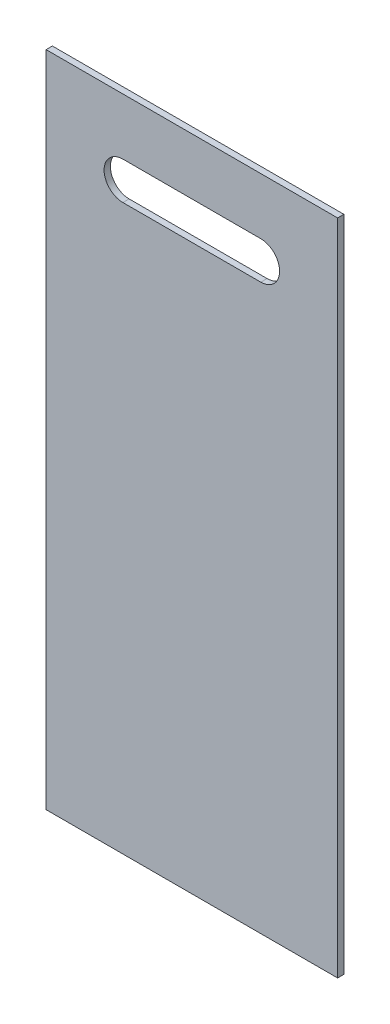
ISO-10303-21;
HEADER;
FILE_DESCRIPTION(('STEP AP214'),'2;1');
FILE_NAME('part.step','',(''),(''),'','','');
FILE_SCHEMA(('AUTOMOTIVE_DESIGN { 1 0 10303 214 1 1 1 1 }'));
ENDSEC;
DATA;
#1=APPLICATION_CONTEXT('core data for automotive mechanical design processes');
#2=APPLICATION_PROTOCOL_DEFINITION('international standard','automotive_design',2000,#1);
#3=PRODUCT_CONTEXT('',#1,'mechanical');
#4=PRODUCT('Part','Part','',(#3));
#5=PRODUCT_RELATED_PRODUCT_CATEGORY('part','',(#4));
#6=PRODUCT_DEFINITION_FORMATION('','',#4);
#7=PRODUCT_DEFINITION_CONTEXT('part definition',#1,'design');
#8=PRODUCT_DEFINITION('design','',#6,#7);
#9=PRODUCT_DEFINITION_SHAPE('','',#8);
#10=(LENGTH_UNIT() NAMED_UNIT(*) SI_UNIT(.MILLI.,.METRE.));
#11=(NAMED_UNIT(*) PLANE_ANGLE_UNIT() SI_UNIT($,.RADIAN.));
#12=(NAMED_UNIT(*) SI_UNIT($,.STERADIAN.) SOLID_ANGLE_UNIT());
#13=UNCERTAINTY_MEASURE_WITH_UNIT(LENGTH_MEASURE(1.E-05),#10,'distance_accuracy_value','');
#14=(GEOMETRIC_REPRESENTATION_CONTEXT(3) GLOBAL_UNCERTAINTY_ASSIGNED_CONTEXT((#13)) GLOBAL_UNIT_ASSIGNED_CONTEXT((#10,
#11,#12)) REPRESENTATION_CONTEXT('',''));
#15=CARTESIAN_POINT('',(0.,0.,0.));
#16=DIRECTION('',(0.,0.,1.));
#17=DIRECTION('',(1.,0.,0.));
#18=AXIS2_PLACEMENT_3D('',#15,#16,#17);
#19=CARTESIAN_POINT('',(0.,0.,5.));
#20=DIRECTION('',(0.,0.,-1.));
#21=DIRECTION('',(-1.,0.,0.));
#22=AXIS2_PLACEMENT_3D('',#19,#20,#21);
#23=PLANE('',#22);
#24=DIRECTION('',(0.,1.,0.));
#25=VECTOR('',#24,1.);
#26=CARTESIAN_POINT('',(116.25,-262.5,5.));
#27=LINE('',#26,#25);
#28=CARTESIAN_POINT('',(116.25,-262.5,5.));
#29=VERTEX_POINT('',#28);
#30=CARTESIAN_POINT('',(116.25,262.5,5.));
#31=VERTEX_POINT('',#30);
#32=EDGE_CURVE('E153',#29,#31,#27,.T.);
#33=ORIENTED_EDGE('',*,*,#32,.T.);
#34=DIRECTION('',(-1.,0.,0.));
#35=VECTOR('',#34,1.);
#36=CARTESIAN_POINT('',(-116.25,262.5,5.));
#37=LINE('',#36,#35);
#38=CARTESIAN_POINT('',(-116.25,262.5,5.));
#39=VERTEX_POINT('',#38);
#40=EDGE_CURVE('E157',#31,#39,#37,.T.);
#41=ORIENTED_EDGE('',*,*,#40,.T.);
#42=DIRECTION('',(0.,-1.,0.));
#43=VECTOR('',#42,1.);
#44=CARTESIAN_POINT('',(-116.25,-262.5,5.));
#45=LINE('',#44,#43);
#46=CARTESIAN_POINT('',(-116.25,-262.5,5.));
#47=VERTEX_POINT('',#46);
#48=EDGE_CURVE('E161',#39,#47,#45,.T.);
#49=ORIENTED_EDGE('',*,*,#48,.T.);
#50=DIRECTION('',(1.,0.,0.));
#51=VECTOR('',#50,1.);
#52=CARTESIAN_POINT('',(-116.25,-262.5,5.));
#53=LINE('',#52,#51);
#54=EDGE_CURVE('E164',#47,#29,#53,.T.);
#55=ORIENTED_EDGE('',*,*,#54,.T.);
#56=EDGE_LOOP('',(#33,#41,#49,#55));
#57=FACE_BOUND('',#56,.T.);
#58=CARTESIAN_POINT('',(-55.,202.5,5.));
#59=DIRECTION('',(0.,0.,1.));
#60=DIRECTION('',(1.,0.,0.));
#61=AXIS2_PLACEMENT_3D('',#58,#59,#60);
#62=CIRCLE('',#61,15.);
#63=CARTESIAN_POINT('',(-55.,217.5,5.));
#64=VERTEX_POINT('',#63);
#65=CARTESIAN_POINT('',(-55.,187.5,5.));
#66=VERTEX_POINT('',#65);
#67=EDGE_CURVE('E105',#64,#66,#62,.T.);
#68=ORIENTED_EDGE('',*,*,#67,.F.);
#69=DIRECTION('',(-1.,0.,0.));
#70=VECTOR('',#69,1.);
#71=CARTESIAN_POINT('',(-55.,217.5,5.));
#72=LINE('',#71,#70);
#73=CARTESIAN_POINT('',(55.,217.5,5.));
#74=VERTEX_POINT('',#73);
#75=EDGE_CURVE('E131',#74,#64,#72,.T.);
#76=ORIENTED_EDGE('',*,*,#75,.F.);
#77=CARTESIAN_POINT('',(55.,202.5,5.));
#78=DIRECTION('',(0.,0.,1.));
#79=DIRECTION('',(1.,0.,0.));
#80=AXIS2_PLACEMENT_3D('',#77,#78,#79);
#81=CIRCLE('',#80,15.);
#82=CARTESIAN_POINT('',(55.,187.5,5.));
#83=VERTEX_POINT('',#82);
#84=EDGE_CURVE('E127',#83,#74,#81,.T.);
#85=ORIENTED_EDGE('',*,*,#84,.F.);
#86=DIRECTION('',(1.,0.,0.));
#87=VECTOR('',#86,1.);
#88=CARTESIAN_POINT('',(-55.,187.5,5.));
#89=LINE('',#88,#87);
#90=EDGE_CURVE('E114',#66,#83,#89,.T.);
#91=ORIENTED_EDGE('',*,*,#90,.F.);
#92=EDGE_LOOP('',(#68,#76,#85,#91));
#93=FACE_BOUND('',#92,.T.);
#94=ADVANCED_FACE('F39',(#57,#93),#23,.F.);
#95=CARTESIAN_POINT('',(0.,0.,0.));
#96=DIRECTION('',(0.,0.,-1.));
#97=DIRECTION('',(-1.,0.,0.));
#98=AXIS2_PLACEMENT_3D('',#95,#96,#97);
#99=PLANE('',#98);
#100=DIRECTION('',(0.,1.,0.));
#101=VECTOR('',#100,1.);
#102=CARTESIAN_POINT('',(116.25,-262.5,0.));
#103=LINE('',#102,#101);
#104=CARTESIAN_POINT('',(116.25,-262.5,0.));
#105=VERTEX_POINT('',#104);
#106=CARTESIAN_POINT('',(116.25,262.5,0.));
#107=VERTEX_POINT('',#106);
#108=EDGE_CURVE('E123',#105,#107,#103,.T.);
#109=ORIENTED_EDGE('',*,*,#108,.F.);
#110=DIRECTION('',(1.,0.,0.));
#111=VECTOR('',#110,1.);
#112=CARTESIAN_POINT('',(-116.25,-262.5,0.));
#113=LINE('',#112,#111);
#114=CARTESIAN_POINT('',(-116.25,-262.5,0.));
#115=VERTEX_POINT('',#114);
#116=EDGE_CURVE('E158',#115,#105,#113,.T.);
#117=ORIENTED_EDGE('',*,*,#116,.F.);
#118=DIRECTION('',(0.,-1.,0.));
#119=VECTOR('',#118,1.);
#120=CARTESIAN_POINT('',(-116.25,-262.5,0.));
#121=LINE('',#120,#119);
#122=CARTESIAN_POINT('',(-116.25,262.5,0.));
#123=VERTEX_POINT('',#122);
#124=EDGE_CURVE('E174',#123,#115,#121,.T.);
#125=ORIENTED_EDGE('',*,*,#124,.F.);
#126=DIRECTION('',(-1.,0.,0.));
#127=VECTOR('',#126,1.);
#128=CARTESIAN_POINT('',(-116.25,262.5,0.));
#129=LINE('',#128,#127);
#130=EDGE_CURVE('E171',#107,#123,#129,.T.);
#131=ORIENTED_EDGE('',*,*,#130,.F.);
#132=EDGE_LOOP('',(#109,#117,#125,#131));
#133=FACE_BOUND('',#132,.T.);
#134=DIRECTION('',(-1.,0.,0.));
#135=VECTOR('',#134,1.);
#136=CARTESIAN_POINT('',(-55.,217.5,0.));
#137=LINE('',#136,#135);
#138=CARTESIAN_POINT('',(55.,217.5,0.));
#139=VERTEX_POINT('',#138);
#140=CARTESIAN_POINT('',(-55.,217.5,0.));
#141=VERTEX_POINT('',#140);
#142=EDGE_CURVE('E115',#139,#141,#137,.T.);
#143=ORIENTED_EDGE('',*,*,#142,.T.);
#144=CARTESIAN_POINT('',(-55.,202.5,0.));
#145=DIRECTION('',(0.,0.,1.));
#146=DIRECTION('',(1.,0.,0.));
#147=AXIS2_PLACEMENT_3D('',#144,#145,#146);
#148=CIRCLE('',#147,15.);
#149=CARTESIAN_POINT('',(-55.,187.5,0.));
#150=VERTEX_POINT('',#149);
#151=EDGE_CURVE('E63',#141,#150,#148,.T.);
#152=ORIENTED_EDGE('',*,*,#151,.T.);
#153=DIRECTION('',(1.,0.,0.));
#154=VECTOR('',#153,1.);
#155=CARTESIAN_POINT('',(-55.,187.5,0.));
#156=LINE('',#155,#154);
#157=CARTESIAN_POINT('',(55.,187.5,0.));
#158=VERTEX_POINT('',#157);
#159=EDGE_CURVE('E121',#150,#158,#156,.T.);
#160=ORIENTED_EDGE('',*,*,#159,.T.);
#161=CARTESIAN_POINT('',(55.,202.5,0.));
#162=DIRECTION('',(0.,0.,1.));
#163=DIRECTION('',(1.,0.,0.));
#164=AXIS2_PLACEMENT_3D('',#161,#162,#163);
#165=CIRCLE('',#164,15.);
#166=EDGE_CURVE('E140',#158,#139,#165,.T.);
#167=ORIENTED_EDGE('',*,*,#166,.T.);
#168=EDGE_LOOP('',(#143,#152,#160,#167));
#169=FACE_BOUND('',#168,.T.);
#170=ADVANCED_FACE('F197',(#133,#169),#99,.T.);
#171=CARTESIAN_POINT('',(116.25,-262.5,5.));
#172=DIRECTION('',(-1.,0.,0.));
#173=DIRECTION('',(0.,0.,1.));
#174=AXIS2_PLACEMENT_3D('',#171,#172,#173);
#175=PLANE('',#174);
#176=ORIENTED_EDGE('',*,*,#108,.T.);
#177=DIRECTION('',(0.,0.,-1.));
#178=VECTOR('',#177,1.);
#179=CARTESIAN_POINT('',(116.25,262.5,5.));
#180=LINE('',#179,#178);
#181=EDGE_CURVE('E11',#31,#107,#180,.T.);
#182=ORIENTED_EDGE('',*,*,#181,.F.);
#183=ORIENTED_EDGE('',*,*,#32,.F.);
#184=DIRECTION('',(0.,0.,-1.));
#185=VECTOR('',#184,1.);
#186=CARTESIAN_POINT('',(116.25,-262.5,5.));
#187=LINE('',#186,#185);
#188=EDGE_CURVE('E167',#29,#105,#187,.T.);
#189=ORIENTED_EDGE('',*,*,#188,.T.);
#190=EDGE_LOOP('',(#176,#182,#183,#189));
#191=FACE_BOUND('',#190,.T.);
#192=ADVANCED_FACE('F41',(#191),#175,.F.);
#193=CARTESIAN_POINT('',(-116.25,262.5,5.));
#194=DIRECTION('',(0.,-1.,0.));
#195=DIRECTION('',(0.,0.,-1.));
#196=AXIS2_PLACEMENT_3D('',#193,#194,#195);
#197=PLANE('',#196);
#198=ORIENTED_EDGE('',*,*,#130,.T.);
#199=DIRECTION('',(0.,0.,-1.));
#200=VECTOR('',#199,1.);
#201=CARTESIAN_POINT('',(-116.25,262.5,5.));
#202=LINE('',#201,#200);
#203=EDGE_CURVE('E48',#39,#123,#202,.T.);
#204=ORIENTED_EDGE('',*,*,#203,.F.);
#205=ORIENTED_EDGE('',*,*,#40,.F.);
#206=ORIENTED_EDGE('',*,*,#181,.T.);
#207=EDGE_LOOP('',(#198,#204,#205,#206));
#208=FACE_BOUND('',#207,.T.);
#209=ADVANCED_FACE('F207',(#208),#197,.F.);
#210=CARTESIAN_POINT('',(-116.25,-262.5,5.));
#211=DIRECTION('',(1.,0.,0.));
#212=DIRECTION('',(0.,0.,-1.));
#213=AXIS2_PLACEMENT_3D('',#210,#211,#212);
#214=PLANE('',#213);
#215=ORIENTED_EDGE('',*,*,#124,.T.);
#216=DIRECTION('',(0.,0.,-1.));
#217=VECTOR('',#216,1.);
#218=CARTESIAN_POINT('',(-116.25,-262.5,5.));
#219=LINE('',#218,#217);
#220=EDGE_CURVE('E182',#47,#115,#219,.T.);
#221=ORIENTED_EDGE('',*,*,#220,.F.);
#222=ORIENTED_EDGE('',*,*,#48,.F.);
#223=ORIENTED_EDGE('',*,*,#203,.T.);
#224=EDGE_LOOP('',(#215,#221,#222,#223));
#225=FACE_BOUND('',#224,.T.);
#226=ADVANCED_FACE('F191',(#225),#214,.F.);
#227=CARTESIAN_POINT('',(-116.25,-262.5,5.));
#228=DIRECTION('',(0.,1.,0.));
#229=DIRECTION('',(0.,0.,1.));
#230=AXIS2_PLACEMENT_3D('',#227,#228,#229);
#231=PLANE('',#230);
#232=ORIENTED_EDGE('',*,*,#116,.T.);
#233=ORIENTED_EDGE('',*,*,#188,.F.);
#234=ORIENTED_EDGE('',*,*,#54,.F.);
#235=ORIENTED_EDGE('',*,*,#220,.T.);
#236=EDGE_LOOP('',(#232,#233,#234,#235));
#237=FACE_BOUND('',#236,.T.);
#238=ADVANCED_FACE('F201',(#237),#231,.F.);
#239=CARTESIAN_POINT('',(-55.,202.5,5.));
#240=DIRECTION('',(0.,0.,-1.));
#241=DIRECTION('',(-1.,0.,0.));
#242=AXIS2_PLACEMENT_3D('',#239,#240,#241);
#243=CYLINDRICAL_SURFACE('',#242,15.);
#244=ORIENTED_EDGE('',*,*,#151,.F.);
#245=DIRECTION('',(0.,0.,-1.));
#246=VECTOR('',#245,1.);
#247=CARTESIAN_POINT('',(-55.,217.5,5.));
#248=LINE('',#247,#246);
#249=EDGE_CURVE('E109',#64,#141,#248,.T.);
#250=ORIENTED_EDGE('',*,*,#249,.F.);
#251=ORIENTED_EDGE('',*,*,#67,.T.);
#252=DIRECTION('',(0.,0.,-1.));
#253=VECTOR('',#252,1.);
#254=CARTESIAN_POINT('',(-55.,187.5,5.));
#255=LINE('',#254,#253);
#256=EDGE_CURVE('E108',#66,#150,#255,.T.);
#257=ORIENTED_EDGE('',*,*,#256,.T.);
#258=EDGE_LOOP('',(#244,#250,#251,#257));
#259=FACE_BOUND('',#258,.T.);
#260=ADVANCED_FACE('F107',(#259),#243,.F.);
#261=CARTESIAN_POINT('',(-55.,187.5,5.));
#262=DIRECTION('',(0.,1.,0.));
#263=DIRECTION('',(0.,0.,1.));
#264=AXIS2_PLACEMENT_3D('',#261,#262,#263);
#265=PLANE('',#264);
#266=ORIENTED_EDGE('',*,*,#159,.F.);
#267=ORIENTED_EDGE('',*,*,#256,.F.);
#268=ORIENTED_EDGE('',*,*,#90,.T.);
#269=DIRECTION('',(0.,0.,-1.));
#270=VECTOR('',#269,1.);
#271=CARTESIAN_POINT('',(55.,187.5,5.));
#272=LINE('',#271,#270);
#273=EDGE_CURVE('E124',#83,#158,#272,.T.);
#274=ORIENTED_EDGE('',*,*,#273,.T.);
#275=EDGE_LOOP('',(#266,#267,#268,#274));
#276=FACE_BOUND('',#275,.T.);
#277=ADVANCED_FACE('F118',(#276),#265,.T.);
#278=CARTESIAN_POINT('',(55.,202.5,5.));
#279=DIRECTION('',(0.,0.,-1.));
#280=DIRECTION('',(-1.,0.,0.));
#281=AXIS2_PLACEMENT_3D('',#278,#279,#280);
#282=CYLINDRICAL_SURFACE('',#281,15.);
#283=ORIENTED_EDGE('',*,*,#166,.F.);
#284=ORIENTED_EDGE('',*,*,#273,.F.);
#285=ORIENTED_EDGE('',*,*,#84,.T.);
#286=DIRECTION('',(0.,0.,-1.));
#287=VECTOR('',#286,1.);
#288=CARTESIAN_POINT('',(55.,217.5,5.));
#289=LINE('',#288,#287);
#290=EDGE_CURVE('E55',#74,#139,#289,.T.);
#291=ORIENTED_EDGE('',*,*,#290,.T.);
#292=EDGE_LOOP('',(#283,#284,#285,#291));
#293=FACE_BOUND('',#292,.T.);
#294=ADVANCED_FACE('F230',(#293),#282,.F.);
#295=CARTESIAN_POINT('',(-55.,217.5,5.));
#296=DIRECTION('',(0.,-1.,0.));
#297=DIRECTION('',(0.,0.,-1.));
#298=AXIS2_PLACEMENT_3D('',#295,#296,#297);
#299=PLANE('',#298);
#300=ORIENTED_EDGE('',*,*,#142,.F.);
#301=ORIENTED_EDGE('',*,*,#290,.F.);
#302=ORIENTED_EDGE('',*,*,#75,.T.);
#303=ORIENTED_EDGE('',*,*,#249,.T.);
#304=EDGE_LOOP('',(#300,#301,#302,#303));
#305=FACE_BOUND('',#304,.T.);
#306=ADVANCED_FACE('F234',(#305),#299,.T.);
#307=CLOSED_SHELL('',(#94,#170,#192,#209,#226,#238,#260,#277,#294,#306));
#308=MANIFOLD_SOLID_BREP('B2',#307);
#309=ADVANCED_BREP_SHAPE_REPRESENTATION('',(#18,#308),#14);
#310=SHAPE_DEFINITION_REPRESENTATION(#9,#309);
ENDSEC;
END-ISO-10303-21;
